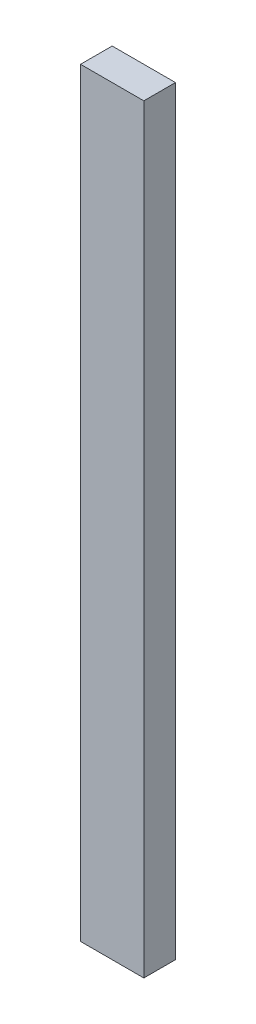
ISO-10303-21;
HEADER;
FILE_DESCRIPTION(('STEP AP214'),'2;1');
FILE_NAME('part.step','',(''),(''),'','','');
FILE_SCHEMA(('AUTOMOTIVE_DESIGN { 1 0 10303 214 1 1 1 1 }'));
ENDSEC;
DATA;
#1=APPLICATION_CONTEXT('core data for automotive mechanical design processes');
#2=APPLICATION_PROTOCOL_DEFINITION('international standard','automotive_design',2000,#1);
#3=PRODUCT_CONTEXT('',#1,'mechanical');
#4=PRODUCT('Part','Part','',(#3));
#5=PRODUCT_RELATED_PRODUCT_CATEGORY('part','',(#4));
#6=PRODUCT_DEFINITION_FORMATION('','',#4);
#7=PRODUCT_DEFINITION_CONTEXT('part definition',#1,'design');
#8=PRODUCT_DEFINITION('design','',#6,#7);
#9=PRODUCT_DEFINITION_SHAPE('','',#8);
#10=(LENGTH_UNIT() NAMED_UNIT(*) SI_UNIT(.MILLI.,.METRE.));
#11=(NAMED_UNIT(*) PLANE_ANGLE_UNIT() SI_UNIT($,.RADIAN.));
#12=(NAMED_UNIT(*) SI_UNIT($,.STERADIAN.) SOLID_ANGLE_UNIT());
#13=UNCERTAINTY_MEASURE_WITH_UNIT(LENGTH_MEASURE(1.E-05),#10,'distance_accuracy_value','');
#14=(GEOMETRIC_REPRESENTATION_CONTEXT(3) GLOBAL_UNCERTAINTY_ASSIGNED_CONTEXT((#13)) GLOBAL_UNIT_ASSIGNED_CONTEXT((#10,
#11,#12)) REPRESENTATION_CONTEXT('',''));
#15=CARTESIAN_POINT('',(0.,0.,0.));
#16=DIRECTION('',(0.,0.,1.));
#17=DIRECTION('',(1.,0.,0.));
#18=AXIS2_PLACEMENT_3D('',#15,#16,#17);
#19=CARTESIAN_POINT('',(0.,0.,3.175));
#20=DIRECTION('',(1.,0.,0.));
#21=DIRECTION('',(0.,0.,-1.));
#22=AXIS2_PLACEMENT_3D('',#19,#20,#21);
#23=PLANE('',#22);
#24=DIRECTION('',(0.,-1.,0.));
#25=VECTOR('',#24,1.);
#26=CARTESIAN_POINT('',(0.,0.,0.));
#27=LINE('',#26,#25);
#28=CARTESIAN_POINT('',(0.,76.2,0.));
#29=VERTEX_POINT('',#28);
#30=CARTESIAN_POINT('',(0.,0.,0.));
#31=VERTEX_POINT('',#30);
#32=EDGE_CURVE('E96',#29,#31,#27,.T.);
#33=ORIENTED_EDGE('',*,*,#32,.T.);
#34=DIRECTION('',(0.,0.,-1.));
#35=VECTOR('',#34,1.);
#36=CARTESIAN_POINT('',(0.,0.,3.175));
#37=LINE('',#36,#35);
#38=CARTESIAN_POINT('',(0.,0.,3.175));
#39=VERTEX_POINT('',#38);
#40=EDGE_CURVE('E11',#39,#31,#37,.T.);
#41=ORIENTED_EDGE('',*,*,#40,.F.);
#42=DIRECTION('',(0.,-1.,0.));
#43=VECTOR('',#42,1.);
#44=CARTESIAN_POINT('',(0.,0.,3.175));
#45=LINE('',#44,#43);
#46=CARTESIAN_POINT('',(0.,76.2,3.175));
#47=VERTEX_POINT('',#46);
#48=EDGE_CURVE('E84',#47,#39,#45,.T.);
#49=ORIENTED_EDGE('',*,*,#48,.F.);
#50=DIRECTION('',(0.,0.,-1.));
#51=VECTOR('',#50,1.);
#52=CARTESIAN_POINT('',(0.,76.2,3.175));
#53=LINE('',#52,#51);
#54=EDGE_CURVE('E92',#47,#29,#53,.T.);
#55=ORIENTED_EDGE('',*,*,#54,.T.);
#56=EDGE_LOOP('',(#33,#41,#49,#55));
#57=FACE_BOUND('',#56,.T.);
#58=ADVANCED_FACE('F33',(#57),#23,.F.);
#59=CARTESIAN_POINT('',(0.,0.,3.175));
#60=DIRECTION('',(0.,1.,0.));
#61=DIRECTION('',(0.,0.,1.));
#62=AXIS2_PLACEMENT_3D('',#59,#60,#61);
#63=PLANE('',#62);
#64=DIRECTION('',(1.,0.,0.));
#65=VECTOR('',#64,1.);
#66=CARTESIAN_POINT('',(0.,0.,0.));
#67=LINE('',#66,#65);
#68=CARTESIAN_POINT('',(6.35,0.,0.));
#69=VERTEX_POINT('',#68);
#70=EDGE_CURVE('E88',#31,#69,#67,.T.);
#71=ORIENTED_EDGE('',*,*,#70,.T.);
#72=DIRECTION('',(0.,0.,-1.));
#73=VECTOR('',#72,1.);
#74=CARTESIAN_POINT('',(6.35,0.,3.175));
#75=LINE('',#74,#73);
#76=CARTESIAN_POINT('',(6.35,0.,3.175));
#77=VERTEX_POINT('',#76);
#78=EDGE_CURVE('E41',#77,#69,#75,.T.);
#79=ORIENTED_EDGE('',*,*,#78,.F.);
#80=DIRECTION('',(1.,0.,0.));
#81=VECTOR('',#80,1.);
#82=CARTESIAN_POINT('',(0.,0.,3.175));
#83=LINE('',#82,#81);
#84=EDGE_CURVE('E79',#39,#77,#83,.T.);
#85=ORIENTED_EDGE('',*,*,#84,.F.);
#86=ORIENTED_EDGE('',*,*,#40,.T.);
#87=EDGE_LOOP('',(#71,#79,#85,#86));
#88=FACE_BOUND('',#87,.T.);
#89=ADVANCED_FACE('F87',(#88),#63,.F.);
#90=CARTESIAN_POINT('',(6.35,0.,3.175));
#91=DIRECTION('',(-1.,0.,0.));
#92=DIRECTION('',(0.,0.,1.));
#93=AXIS2_PLACEMENT_3D('',#90,#91,#92);
#94=PLANE('',#93);
#95=DIRECTION('',(0.,1.,0.));
#96=VECTOR('',#95,1.);
#97=CARTESIAN_POINT('',(6.35,0.,0.));
#98=LINE('',#97,#96);
#99=CARTESIAN_POINT('',(6.35,76.2,0.));
#100=VERTEX_POINT('',#99);
#101=EDGE_CURVE('E66',#69,#100,#98,.T.);
#102=ORIENTED_EDGE('',*,*,#101,.T.);
#103=DIRECTION('',(0.,0.,-1.));
#104=VECTOR('',#103,1.);
#105=CARTESIAN_POINT('',(6.35,76.2,3.175));
#106=LINE('',#105,#104);
#107=CARTESIAN_POINT('',(6.35,76.2,3.175));
#108=VERTEX_POINT('',#107);
#109=EDGE_CURVE('E89',#108,#100,#106,.T.);
#110=ORIENTED_EDGE('',*,*,#109,.F.);
#111=DIRECTION('',(0.,1.,0.));
#112=VECTOR('',#111,1.);
#113=CARTESIAN_POINT('',(6.35,0.,3.175));
#114=LINE('',#113,#112);
#115=EDGE_CURVE('E82',#77,#108,#114,.T.);
#116=ORIENTED_EDGE('',*,*,#115,.F.);
#117=ORIENTED_EDGE('',*,*,#78,.T.);
#118=EDGE_LOOP('',(#102,#110,#116,#117));
#119=FACE_BOUND('',#118,.T.);
#120=ADVANCED_FACE('F90',(#119),#94,.F.);
#121=CARTESIAN_POINT('',(0.,76.2,3.175));
#122=DIRECTION('',(0.,-1.,0.));
#123=DIRECTION('',(0.,0.,-1.));
#124=AXIS2_PLACEMENT_3D('',#121,#122,#123);
#125=PLANE('',#124);
#126=DIRECTION('',(-1.,0.,0.));
#127=VECTOR('',#126,1.);
#128=CARTESIAN_POINT('',(0.,76.2,0.));
#129=LINE('',#128,#127);
#130=EDGE_CURVE('E72',#100,#29,#129,.T.);
#131=ORIENTED_EDGE('',*,*,#130,.T.);
#132=ORIENTED_EDGE('',*,*,#54,.F.);
#133=DIRECTION('',(-1.,0.,0.));
#134=VECTOR('',#133,1.);
#135=CARTESIAN_POINT('',(0.,76.2,3.175));
#136=LINE('',#135,#134);
#137=EDGE_CURVE('E49',#108,#47,#136,.T.);
#138=ORIENTED_EDGE('',*,*,#137,.F.);
#139=ORIENTED_EDGE('',*,*,#109,.T.);
#140=EDGE_LOOP('',(#131,#132,#138,#139));
#141=FACE_BOUND('',#140,.T.);
#142=ADVANCED_FACE('F103',(#141),#125,.F.);
#143=CARTESIAN_POINT('',(0.,0.,3.175));
#144=DIRECTION('',(0.,0.,-1.));
#145=DIRECTION('',(-1.,0.,0.));
#146=AXIS2_PLACEMENT_3D('',#143,#144,#145);
#147=PLANE('',#146);
#148=ORIENTED_EDGE('',*,*,#48,.T.);
#149=ORIENTED_EDGE('',*,*,#84,.T.);
#150=ORIENTED_EDGE('',*,*,#115,.T.);
#151=ORIENTED_EDGE('',*,*,#137,.T.);
#152=EDGE_LOOP('',(#148,#149,#150,#151));
#153=FACE_BOUND('',#152,.T.);
#154=ADVANCED_FACE('F80',(#153),#147,.F.);
#155=CARTESIAN_POINT('',(0.,0.,0.));
#156=DIRECTION('',(0.,0.,-1.));
#157=DIRECTION('',(-1.,0.,0.));
#158=AXIS2_PLACEMENT_3D('',#155,#156,#157);
#159=PLANE('',#158);
#160=ORIENTED_EDGE('',*,*,#32,.F.);
#161=ORIENTED_EDGE('',*,*,#130,.F.);
#162=ORIENTED_EDGE('',*,*,#101,.F.);
#163=ORIENTED_EDGE('',*,*,#70,.F.);
#164=EDGE_LOOP('',(#160,#161,#162,#163));
#165=FACE_BOUND('',#164,.T.);
#166=ADVANCED_FACE('F106',(#165),#159,.T.);
#167=CLOSED_SHELL('',(#58,#89,#120,#142,#154,#166));
#168=MANIFOLD_SOLID_BREP('B2',#167);
#169=ADVANCED_BREP_SHAPE_REPRESENTATION('',(#18,#168),#14);
#170=SHAPE_DEFINITION_REPRESENTATION(#9,#169);
ENDSEC;
END-ISO-10303-21;
